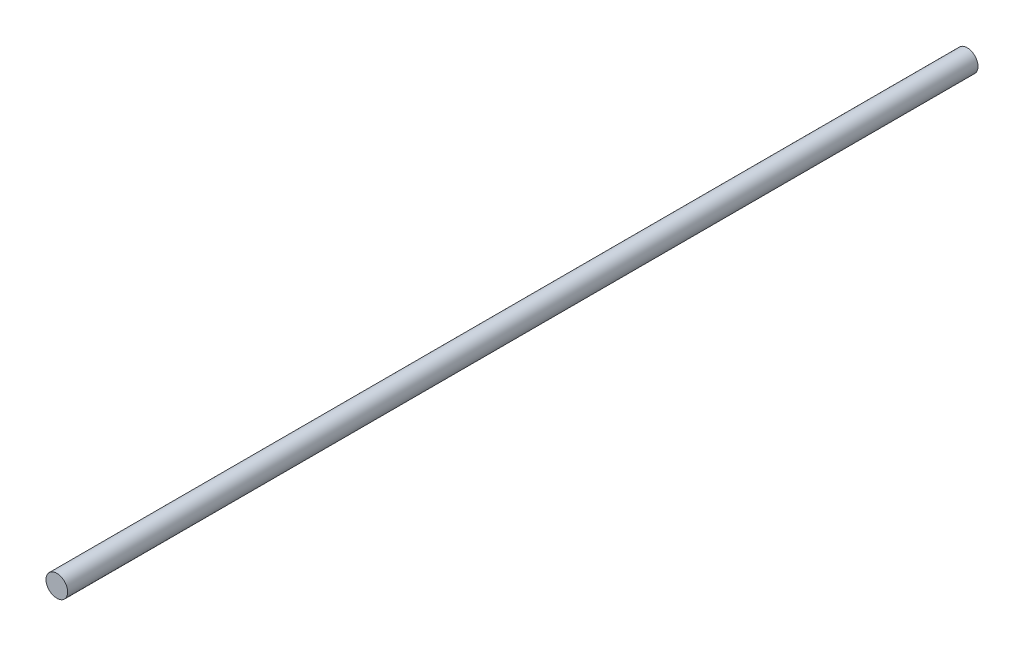
ISO-10303-21;
HEADER;
FILE_DESCRIPTION(('STEP AP214'),'2;1');
FILE_NAME('part.step','',(''),(''),'','','');
FILE_SCHEMA(('AUTOMOTIVE_DESIGN { 1 0 10303 214 1 1 1 1 }'));
ENDSEC;
DATA;
#1=APPLICATION_CONTEXT('core data for automotive mechanical design processes');
#2=APPLICATION_PROTOCOL_DEFINITION('international standard','automotive_design',2000,#1);
#3=PRODUCT_CONTEXT('',#1,'mechanical');
#4=PRODUCT('Part','Part','',(#3));
#5=PRODUCT_RELATED_PRODUCT_CATEGORY('part','',(#4));
#6=PRODUCT_DEFINITION_FORMATION('','',#4);
#7=PRODUCT_DEFINITION_CONTEXT('part definition',#1,'design');
#8=PRODUCT_DEFINITION('design','',#6,#7);
#9=PRODUCT_DEFINITION_SHAPE('','',#8);
#10=(LENGTH_UNIT() NAMED_UNIT(*) SI_UNIT(.MILLI.,.METRE.));
#11=(NAMED_UNIT(*) PLANE_ANGLE_UNIT() SI_UNIT($,.RADIAN.));
#12=(NAMED_UNIT(*) SI_UNIT($,.STERADIAN.) SOLID_ANGLE_UNIT());
#13=UNCERTAINTY_MEASURE_WITH_UNIT(LENGTH_MEASURE(1.E-05),#10,'distance_accuracy_value','');
#14=(GEOMETRIC_REPRESENTATION_CONTEXT(3) GLOBAL_UNCERTAINTY_ASSIGNED_CONTEXT((#13)) GLOBAL_UNIT_ASSIGNED_CONTEXT((#10,
#11,#12)) REPRESENTATION_CONTEXT('',''));
#15=CARTESIAN_POINT('',(0.,0.,0.));
#16=DIRECTION('',(0.,0.,1.));
#17=DIRECTION('',(1.,0.,0.));
#18=AXIS2_PLACEMENT_3D('',#15,#16,#17);
#19=CARTESIAN_POINT('',(0.,0.,336.));
#20=DIRECTION('',(0.,0.,-1.));
#21=DIRECTION('',(-1.,0.,0.));
#22=AXIS2_PLACEMENT_3D('',#19,#20,#21);
#23=CYLINDRICAL_SURFACE('',#22,4.);
#24=CARTESIAN_POINT('',(0.,0.,336.));
#25=DIRECTION('',(0.,0.,1.));
#26=DIRECTION('',(1.,0.,0.));
#27=AXIS2_PLACEMENT_3D('',#24,#25,#26);
#28=CIRCLE('',#27,4.);
#29=CARTESIAN_POINT('',(-4.,0.,336.));
#30=VERTEX_POINT('',#29);
#31=EDGE_CURVE('E10',#30,#30,#28,.T.);
#32=CARTESIAN_POINT('',(0.,0.,0.));
#33=DIRECTION('',(0.,0.,1.));
#34=DIRECTION('',(1.,0.,0.));
#35=AXIS2_PLACEMENT_3D('',#32,#33,#34);
#36=CIRCLE('',#35,4.);
#37=CARTESIAN_POINT('',(-4.,0.,0.));
#38=VERTEX_POINT('',#37);
#39=EDGE_CURVE('E36',#38,#38,#36,.T.);
#40=CARTESIAN_POINT('',(-4.,0.,336.));
#41=CARTESIAN_POINT('',(-4.,0.,332.5));
#42=CARTESIAN_POINT('',(-4.,0.,329.));
#43=CARTESIAN_POINT('',(-4.,0.,322.));
#44=CARTESIAN_POINT('',(-4.,0.,318.5));
#45=CARTESIAN_POINT('',(-4.,0.,311.5));
#46=CARTESIAN_POINT('',(-4.,0.,308.));
#47=CARTESIAN_POINT('',(-4.,0.,301.));
#48=CARTESIAN_POINT('',(-4.,0.,297.5));
#49=CARTESIAN_POINT('',(-4.,0.,290.5));
#50=CARTESIAN_POINT('',(-4.,0.,287.));
#51=CARTESIAN_POINT('',(-4.,0.,280.));
#52=CARTESIAN_POINT('',(-4.,0.,276.5));
#53=CARTESIAN_POINT('',(-4.,0.,269.5));
#54=CARTESIAN_POINT('',(-4.,0.,266.));
#55=CARTESIAN_POINT('',(-4.,0.,259.));
#56=CARTESIAN_POINT('',(-4.,0.,255.5));
#57=CARTESIAN_POINT('',(-4.,0.,248.5));
#58=CARTESIAN_POINT('',(-4.,0.,245.));
#59=CARTESIAN_POINT('',(-4.,0.,238.));
#60=CARTESIAN_POINT('',(-4.,0.,234.5));
#61=CARTESIAN_POINT('',(-4.,0.,227.5));
#62=CARTESIAN_POINT('',(-4.,0.,224.));
#63=CARTESIAN_POINT('',(-4.,0.,217.));
#64=CARTESIAN_POINT('',(-4.,0.,213.5));
#65=CARTESIAN_POINT('',(-4.,0.,206.5));
#66=CARTESIAN_POINT('',(-4.,0.,203.));
#67=CARTESIAN_POINT('',(-4.,0.,196.));
#68=CARTESIAN_POINT('',(-4.,0.,192.5));
#69=CARTESIAN_POINT('',(-4.,0.,185.5));
#70=CARTESIAN_POINT('',(-4.,0.,182.));
#71=CARTESIAN_POINT('',(-4.,0.,175.));
#72=CARTESIAN_POINT('',(-4.,0.,171.5));
#73=CARTESIAN_POINT('',(-4.,0.,164.5));
#74=CARTESIAN_POINT('',(-4.,0.,161.));
#75=CARTESIAN_POINT('',(-4.,0.,154.));
#76=CARTESIAN_POINT('',(-4.,0.,150.5));
#77=CARTESIAN_POINT('',(-4.,0.,143.5));
#78=CARTESIAN_POINT('',(-4.,0.,140.));
#79=CARTESIAN_POINT('',(-4.,0.,133.));
#80=CARTESIAN_POINT('',(-4.,0.,129.5));
#81=CARTESIAN_POINT('',(-4.,0.,122.5));
#82=CARTESIAN_POINT('',(-4.,0.,119.));
#83=CARTESIAN_POINT('',(-4.,0.,112.));
#84=CARTESIAN_POINT('',(-4.,0.,108.5));
#85=CARTESIAN_POINT('',(-4.,0.,101.5));
#86=CARTESIAN_POINT('',(-4.,0.,98.));
#87=CARTESIAN_POINT('',(-4.,0.,91.));
#88=CARTESIAN_POINT('',(-4.,0.,87.5));
#89=CARTESIAN_POINT('',(-4.,0.,80.5));
#90=CARTESIAN_POINT('',(-4.,0.,77.));
#91=CARTESIAN_POINT('',(-4.,0.,70.));
#92=CARTESIAN_POINT('',(-4.,0.,66.5));
#93=CARTESIAN_POINT('',(-4.,0.,59.5));
#94=CARTESIAN_POINT('',(-4.,0.,56.));
#95=CARTESIAN_POINT('',(-4.,0.,49.));
#96=CARTESIAN_POINT('',(-4.,0.,45.5));
#97=CARTESIAN_POINT('',(-4.,0.,38.5));
#98=CARTESIAN_POINT('',(-4.,0.,35.));
#99=CARTESIAN_POINT('',(-4.,0.,28.));
#100=CARTESIAN_POINT('',(-4.,0.,24.5));
#101=CARTESIAN_POINT('',(-4.,0.,17.5));
#102=CARTESIAN_POINT('',(-4.,0.,14.));
#103=CARTESIAN_POINT('',(-4.,0.,7.));
#104=CARTESIAN_POINT('',(-4.,0.,3.5));
#105=CARTESIAN_POINT('',(-4.,0.,0.));
#106=B_SPLINE_CURVE_WITH_KNOTS('',3,(#40,#41,#42,#43,#44,#45,#46,#47,#48,#49,#50,#51,#52,#53,
#54,#55,#56,#57,#58,#59,#60,#61,#62,#63,#64,#65,#66,#67,#68,#69,#70,#71,#72,#73,#74,#75,#76,#77,
#78,#79,#80,#81,#82,#83,#84,#85,#86,#87,#88,#89,#90,#91,#92,#93,#94,#95,#96,#97,#98,#99,#100,
#101,#102,#103,#104,#105),.UNSPECIFIED.,.F.,.F.,(4,2,2,2,2,2,2,2,2,2,2,2,2,2,2,2,2,2,2,2,2,2,2,
2,2,2,2,2,2,2,2,2,4),(0.,10.5,21.,31.5,42.,52.5,63.,73.5,84.,94.5,105.,115.5,126.,136.5,147.,
157.5,168.,178.5,189.,199.5,210.,220.5,231.,241.5,252.,262.5,273.,283.5,294.,304.5,315.,325.5,
336.),.UNSPECIFIED.);
#107=EDGE_CURVE('BSEAM33',#30,#38,#106,.T.);
#108=ORIENTED_EDGE('',*,*,#31,.F.);
#109=ORIENTED_EDGE('',*,*,#39,.T.);
#110=ORIENTED_EDGE('',*,*,#107,.T.);
#111=ORIENTED_EDGE('',*,*,#107,.F.);
#112=EDGE_LOOP('',(#108,#110,#109,#111));
#113=FACE_BOUND('',#112,.T.);
#114=ADVANCED_FACE('F33',(#113),#23,.T.);
#115=CARTESIAN_POINT('',(0.,0.,336.));
#116=DIRECTION('',(0.,0.,1.));
#117=DIRECTION('',(1.,0.,0.));
#118=AXIS2_PLACEMENT_3D('',#115,#116,#117);
#119=PLANE('',#118);
#120=ORIENTED_EDGE('',*,*,#31,.T.);
#121=EDGE_LOOP('',(#120));
#122=FACE_BOUND('',#121,.T.);
#123=ADVANCED_FACE('F48',(#122),#119,.T.);
#124=CARTESIAN_POINT('',(0.,0.,0.));
#125=DIRECTION('',(0.,0.,1.));
#126=DIRECTION('',(1.,0.,0.));
#127=AXIS2_PLACEMENT_3D('',#124,#125,#126);
#128=PLANE('',#127);
#129=ORIENTED_EDGE('',*,*,#39,.F.);
#130=EDGE_LOOP('',(#129));
#131=FACE_BOUND('',#130,.T.);
#132=ADVANCED_FACE('F46',(#131),#128,.F.);
#133=CLOSED_SHELL('',(#114,#123,#132));
#134=MANIFOLD_SOLID_BREP('B2',#133);
#135=ADVANCED_BREP_SHAPE_REPRESENTATION('',(#18,#134),#14);
#136=SHAPE_DEFINITION_REPRESENTATION(#9,#135);
ENDSEC;
END-ISO-10303-21;
